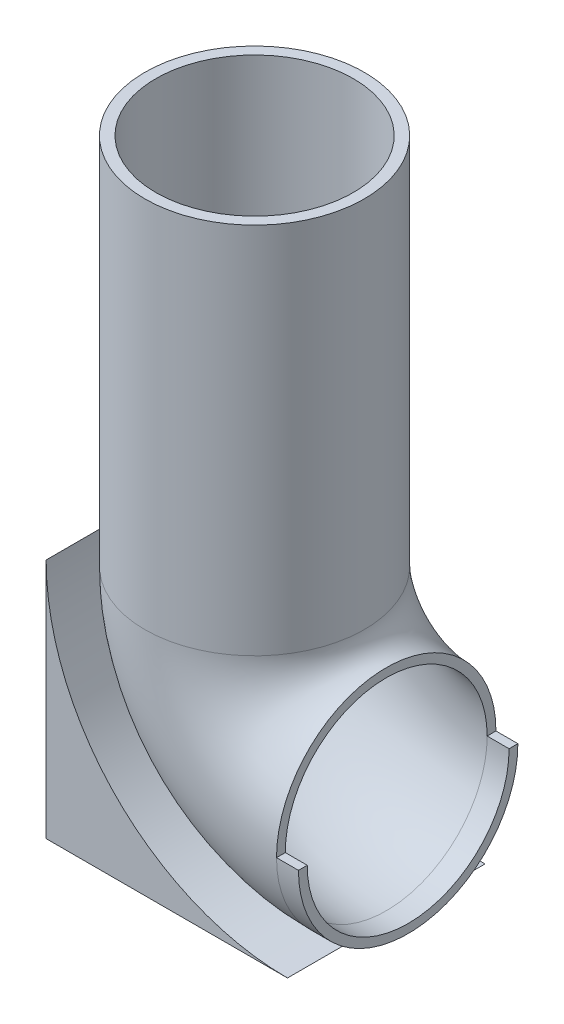
ISO-10303-21;
HEADER;
FILE_DESCRIPTION(('STEP AP214'),'2;1');
FILE_NAME('part.step','',(''),(''),'','','');
FILE_SCHEMA(('AUTOMOTIVE_DESIGN { 1 0 10303 214 1 1 1 1 }'));
ENDSEC;
DATA;
#1=APPLICATION_CONTEXT('core data for automotive mechanical design processes');
#2=APPLICATION_PROTOCOL_DEFINITION('international standard','automotive_design',2000,#1);
#3=PRODUCT_CONTEXT('',#1,'mechanical');
#4=PRODUCT('Part','Part','',(#3));
#5=PRODUCT_RELATED_PRODUCT_CATEGORY('part','',(#4));
#6=PRODUCT_DEFINITION_FORMATION('','',#4);
#7=PRODUCT_DEFINITION_CONTEXT('part definition',#1,'design');
#8=PRODUCT_DEFINITION('design','',#6,#7);
#9=PRODUCT_DEFINITION_SHAPE('','',#8);
#10=(LENGTH_UNIT() NAMED_UNIT(*) SI_UNIT(.MILLI.,.METRE.));
#11=(NAMED_UNIT(*) PLANE_ANGLE_UNIT() SI_UNIT($,.RADIAN.));
#12=(NAMED_UNIT(*) SI_UNIT($,.STERADIAN.) SOLID_ANGLE_UNIT());
#13=UNCERTAINTY_MEASURE_WITH_UNIT(LENGTH_MEASURE(1.E-05),#10,'distance_accuracy_value','');
#14=(GEOMETRIC_REPRESENTATION_CONTEXT(3) GLOBAL_UNCERTAINTY_ASSIGNED_CONTEXT((#13)) GLOBAL_UNIT_ASSIGNED_CONTEXT((#10,
#11,#12)) REPRESENTATION_CONTEXT('',''));
#15=CARTESIAN_POINT('',(0.,0.,0.));
#16=DIRECTION('',(0.,0.,1.));
#17=DIRECTION('',(1.,0.,0.));
#18=AXIS2_PLACEMENT_3D('',#15,#16,#17);
#19=CARTESIAN_POINT('',(0.,0.,22.5));
#20=DIRECTION('',(0.,0.,-1.));
#21=DIRECTION('',(-1.,0.,0.));
#22=AXIS2_PLACEMENT_3D('',#19,#20,#21);
#23=PLANE('',#22);
#24=CARTESIAN_POINT('',(30.0000000000001,0.,22.5));
#25=DIRECTION('',(0.,0.,-1.));
#26=DIRECTION('',(-1.,0.,0.));
#27=AXIS2_PLACEMENT_3D('',#24,#25,#26);
#28=CIRCLE('',#27,55.0000000000001);
#29=CARTESIAN_POINT('',(30.0000000000002,-55.,22.5));
#30=VERTEX_POINT('',#29);
#31=CARTESIAN_POINT('',(-25.,0.,22.5));
#32=VERTEX_POINT('',#31);
#33=EDGE_CURVE('E110',#30,#32,#28,.T.);
#34=ORIENTED_EDGE('',*,*,#33,.T.);
#35=DIRECTION('',(0.,-1.,0.));
#36=VECTOR('',#35,1.);
#37=CARTESIAN_POINT('',(-25.,0.,22.5));
#38=LINE('',#37,#36);
#39=CARTESIAN_POINT('',(-25.,-55.,22.5));
#40=VERTEX_POINT('',#39);
#41=EDGE_CURVE('E115',#32,#40,#38,.T.);
#42=ORIENTED_EDGE('',*,*,#41,.T.);
#43=DIRECTION('',(-1.,0.,0.));
#44=VECTOR('',#43,1.);
#45=CARTESIAN_POINT('',(30.0000000000002,-55.,22.5));
#46=LINE('',#45,#44);
#47=EDGE_CURVE('E90',#30,#40,#46,.T.);
#48=ORIENTED_EDGE('',*,*,#47,.F.);
#49=EDGE_LOOP('',(#34,#42,#48));
#50=FACE_BOUND('',#49,.T.);
#51=ADVANCED_FACE('F81',(#50),#23,.F.);
#52=CARTESIAN_POINT('',(0.,0.,-22.5));
#53=DIRECTION('',(0.,0.,-1.));
#54=DIRECTION('',(-1.,0.,0.));
#55=AXIS2_PLACEMENT_3D('',#52,#53,#54);
#56=PLANE('',#55);
#57=CARTESIAN_POINT('',(30.0000000000001,0.,-22.5));
#58=DIRECTION('',(0.,0.,-1.));
#59=DIRECTION('',(-1.,0.,0.));
#60=AXIS2_PLACEMENT_3D('',#57,#58,#59);
#61=CIRCLE('',#60,55.0000000000001);
#62=CARTESIAN_POINT('',(30.0000000000002,-55.,-22.5));
#63=VERTEX_POINT('',#62);
#64=CARTESIAN_POINT('',(-25.,0.,-22.5));
#65=VERTEX_POINT('',#64);
#66=EDGE_CURVE('E125',#63,#65,#61,.T.);
#67=ORIENTED_EDGE('',*,*,#66,.F.);
#68=DIRECTION('',(-1.,0.,0.));
#69=VECTOR('',#68,1.);
#70=CARTESIAN_POINT('',(30.0000000000002,-55.,-22.5));
#71=LINE('',#70,#69);
#72=CARTESIAN_POINT('',(-25.,-55.,-22.5));
#73=VERTEX_POINT('',#72);
#74=EDGE_CURVE('E13',#63,#73,#71,.T.);
#75=ORIENTED_EDGE('',*,*,#74,.T.);
#76=DIRECTION('',(0.,-1.,0.));
#77=VECTOR('',#76,1.);
#78=CARTESIAN_POINT('',(-25.,0.,-22.5));
#79=LINE('',#78,#77);
#80=EDGE_CURVE('E141',#65,#73,#79,.T.);
#81=ORIENTED_EDGE('',*,*,#80,.F.);
#82=EDGE_LOOP('',(#67,#75,#81));
#83=FACE_BOUND('',#82,.T.);
#84=ADVANCED_FACE('F157',(#83),#56,.T.);
#85=CARTESIAN_POINT('',(30.0000000000001,0.,-22.5));
#86=DIRECTION('',(0.,0.,1.));
#87=DIRECTION('',(1.,0.,0.));
#88=AXIS2_PLACEMENT_3D('',#85,#86,#87);
#89=CYLINDRICAL_SURFACE('',#88,55.0000000000001);
#90=ORIENTED_EDGE('',*,*,#33,.F.);
#91=DIRECTION('',(0.,0.,1.));
#92=VECTOR('',#91,1.);
#93=CARTESIAN_POINT('',(30.0000000000002,-55.,-22.5));
#94=LINE('',#93,#92);
#95=EDGE_CURVE('E121',#63,#30,#94,.T.);
#96=ORIENTED_EDGE('',*,*,#95,.F.);
#97=ORIENTED_EDGE('',*,*,#66,.T.);
#98=DIRECTION('',(0.,0.,1.));
#99=VECTOR('',#98,1.);
#100=CARTESIAN_POINT('',(-25.,0.,-22.5));
#101=LINE('',#100,#99);
#102=EDGE_CURVE('E129',#65,#32,#101,.T.);
#103=ORIENTED_EDGE('',*,*,#102,.T.);
#104=EDGE_LOOP('',(#90,#96,#97,#103));
#105=FACE_BOUND('',#104,.T.);
#106=ADVANCED_FACE('F127',(#105),#89,.F.);
#107=CARTESIAN_POINT('',(-25.,0.,-22.5));
#108=DIRECTION('',(-1.,0.,0.));
#109=DIRECTION('',(0.,0.,1.));
#110=AXIS2_PLACEMENT_3D('',#107,#108,#109);
#111=PLANE('',#110);
#112=ORIENTED_EDGE('',*,*,#41,.F.);
#113=ORIENTED_EDGE('',*,*,#102,.F.);
#114=ORIENTED_EDGE('',*,*,#80,.T.);
#115=DIRECTION('',(0.,0.,1.));
#116=VECTOR('',#115,1.);
#117=CARTESIAN_POINT('',(-25.,-55.,-22.5));
#118=LINE('',#117,#116);
#119=EDGE_CURVE('E118',#73,#40,#118,.T.);
#120=ORIENTED_EDGE('',*,*,#119,.T.);
#121=EDGE_LOOP('',(#112,#113,#114,#120));
#122=FACE_BOUND('',#121,.T.);
#123=ADVANCED_FACE('F156',(#122),#111,.T.);
#124=CARTESIAN_POINT('',(30.0000000000002,-55.,-22.5));
#125=DIRECTION('',(0.,1.,0.));
#126=DIRECTION('',(0.,0.,1.));
#127=AXIS2_PLACEMENT_3D('',#124,#125,#126);
#128=PLANE('',#127);
#129=CARTESIAN_POINT('',(-10.,-55.,15.));
#130=DIRECTION('',(0.,-1.,0.));
#131=DIRECTION('',(0.,0.,-1.));
#132=AXIS2_PLACEMENT_3D('',#129,#130,#131);
#133=CIRCLE('',#132,4.);
#134=CARTESIAN_POINT('',(-10.,-55.,11.));
#135=VERTEX_POINT('',#134);
#136=EDGE_CURVE('E133',#135,#135,#133,.T.);
#137=ORIENTED_EDGE('',*,*,#136,.F.);
#138=EDGE_LOOP('',(#137));
#139=FACE_BOUND('',#138,.T.);
#140=CARTESIAN_POINT('',(-10.,-55.,-15.));
#141=DIRECTION('',(0.,-1.,0.));
#142=DIRECTION('',(0.,0.,-1.));
#143=AXIS2_PLACEMENT_3D('',#140,#141,#142);
#144=CIRCLE('',#143,4.);
#145=CARTESIAN_POINT('',(-10.,-55.,-19.));
#146=VERTEX_POINT('',#145);
#147=EDGE_CURVE('E194',#146,#146,#144,.T.);
#148=ORIENTED_EDGE('',*,*,#147,.F.);
#149=EDGE_LOOP('',(#148));
#150=FACE_BOUND('',#149,.T.);
#151=ORIENTED_EDGE('',*,*,#47,.T.);
#152=ORIENTED_EDGE('',*,*,#119,.F.);
#153=ORIENTED_EDGE('',*,*,#74,.F.);
#154=ORIENTED_EDGE('',*,*,#95,.T.);
#155=EDGE_LOOP('',(#151,#152,#153,#154));
#156=FACE_BOUND('',#155,.T.);
#157=ADVANCED_FACE('F122',(#139,#150,#156),#128,.F.);
#158=CARTESIAN_POINT('',(-10.,-49.,-15.));
#159=DIRECTION('',(0.,-1.,0.));
#160=DIRECTION('',(0.,0.,-1.));
#161=AXIS2_PLACEMENT_3D('',#158,#159,#160);
#162=CYLINDRICAL_SURFACE('',#161,4.);
#163=CARTESIAN_POINT('',(-10.,-49.,-15.));
#164=DIRECTION('',(0.,-1.,0.));
#165=DIRECTION('',(0.,0.,-1.));
#166=AXIS2_PLACEMENT_3D('',#163,#164,#165);
#167=CIRCLE('',#166,4.);
#168=CARTESIAN_POINT('',(-10.,-49.,-19.));
#169=VERTEX_POINT('',#168);
#170=EDGE_CURVE('E197',#169,#169,#167,.T.);
#171=ORIENTED_EDGE('',*,*,#170,.F.);
#172=EDGE_LOOP('',(#171));
#173=FACE_BOUND('',#172,.T.);
#174=ORIENTED_EDGE('',*,*,#147,.T.);
#175=EDGE_LOOP('',(#174));
#176=FACE_BOUND('',#175,.T.);
#177=ADVANCED_FACE('F164',(#173,#176),#162,.F.);
#178=CARTESIAN_POINT('',(-10.,-49.,-15.));
#179=DIRECTION('',(0.,-1.,0.));
#180=DIRECTION('',(0.,0.,-1.));
#181=AXIS2_PLACEMENT_3D('',#178,#179,#180);
#182=PLANE('',#181);
#183=ORIENTED_EDGE('',*,*,#170,.T.);
#184=EDGE_LOOP('',(#183));
#185=FACE_BOUND('',#184,.T.);
#186=ADVANCED_FACE('F172',(#185),#182,.T.);
#187=CARTESIAN_POINT('',(-10.,-49.,15.));
#188=DIRECTION('',(0.,-1.,0.));
#189=DIRECTION('',(0.,0.,-1.));
#190=AXIS2_PLACEMENT_3D('',#187,#188,#189);
#191=CYLINDRICAL_SURFACE('',#190,4.);
#192=CARTESIAN_POINT('',(-10.,-49.,15.));
#193=DIRECTION('',(0.,-1.,0.));
#194=DIRECTION('',(0.,0.,-1.));
#195=AXIS2_PLACEMENT_3D('',#192,#193,#194);
#196=CIRCLE('',#195,4.);
#197=CARTESIAN_POINT('',(-10.,-49.,11.));
#198=VERTEX_POINT('',#197);
#199=EDGE_CURVE('E130',#198,#198,#196,.T.);
#200=ORIENTED_EDGE('',*,*,#199,.F.);
#201=EDGE_LOOP('',(#200));
#202=FACE_BOUND('',#201,.T.);
#203=ORIENTED_EDGE('',*,*,#136,.T.);
#204=EDGE_LOOP('',(#203));
#205=FACE_BOUND('',#204,.T.);
#206=ADVANCED_FACE('F180',(#202,#205),#191,.F.);
#207=CARTESIAN_POINT('',(-10.,-49.,15.));
#208=DIRECTION('',(0.,-1.,0.));
#209=DIRECTION('',(0.,0.,-1.));
#210=AXIS2_PLACEMENT_3D('',#207,#208,#209);
#211=PLANE('',#210);
#212=ORIENTED_EDGE('',*,*,#199,.T.);
#213=EDGE_LOOP('',(#212));
#214=FACE_BOUND('',#213,.T.);
#215=ADVANCED_FACE('F185',(#214),#211,.T.);
#216=CLOSED_SHELL('',(#51,#84,#106,#123,#157,#177,#186,#206,#215));
#217=MANIFOLD_SOLID_BREP('B2',#216);
#218=CARTESIAN_POINT('',(0.,85.,0.));
#219=DIRECTION('',(0.,1.,0.));
#220=DIRECTION('',(0.,0.,1.));
#221=AXIS2_PLACEMENT_3D('',#218,#219,#220);
#222=PLANE('',#221);
#223=CARTESIAN_POINT('',(0.,85.,0.));
#224=DIRECTION('',(0.,1.,0.));
#225=DIRECTION('',(0.,0.,1.));
#226=AXIS2_PLACEMENT_3D('',#223,#224,#225);
#227=CIRCLE('',#226,25.);
#228=CARTESIAN_POINT('',(0.,85.,25.));
#229=VERTEX_POINT('',#228);
#230=EDGE_CURVE('E343',#229,#229,#227,.T.);
#231=ORIENTED_EDGE('',*,*,#230,.T.);
#232=EDGE_LOOP('',(#231));
#233=FACE_BOUND('',#232,.T.);
#234=CARTESIAN_POINT('',(0.,85.,0.));
#235=DIRECTION('',(0.,1.,0.));
#236=DIRECTION('',(0.,0.,1.));
#237=AXIS2_PLACEMENT_3D('',#234,#235,#236);
#238=CIRCLE('',#237,22.5);
#239=CARTESIAN_POINT('',(0.,85.,22.5));
#240=VERTEX_POINT('',#239);
#241=EDGE_CURVE('E339',#240,#240,#238,.T.);
#242=ORIENTED_EDGE('',*,*,#241,.F.);
#243=EDGE_LOOP('',(#242));
#244=FACE_BOUND('',#243,.T.);
#245=ADVANCED_FACE('F256',(#233,#244),#222,.T.);
#246=CARTESIAN_POINT('',(0.,85.,0.));
#247=DIRECTION('',(0.,-1.,0.));
#248=DIRECTION('',(0.,0.,-1.));
#249=AXIS2_PLACEMENT_3D('',#246,#247,#248);
#250=CYLINDRICAL_SURFACE('',#249,25.);
#251=ORIENTED_EDGE('',*,*,#230,.F.);
#252=EDGE_LOOP('',(#251));
#253=FACE_BOUND('',#252,.T.);
#254=CARTESIAN_POINT('',(0.,0.,0.));
#255=DIRECTION('',(0.,1.,0.));
#256=DIRECTION('',(0.,0.,1.));
#257=AXIS2_PLACEMENT_3D('',#254,#255,#256);
#258=CIRCLE('',#257,25.);
#259=CARTESIAN_POINT('',(0.,0.,25.));
#260=VERTEX_POINT('',#259);
#261=EDGE_CURVE('E330',#260,#260,#258,.T.);
#262=ORIENTED_EDGE('',*,*,#261,.T.);
#263=EDGE_LOOP('',(#262));
#264=FACE_BOUND('',#263,.T.);
#265=ADVANCED_FACE('F258',(#253,#264),#250,.T.);
#266=CARTESIAN_POINT('',(0.,85.,0.));
#267=DIRECTION('',(0.,-1.,0.));
#268=DIRECTION('',(0.,0.,-1.));
#269=AXIS2_PLACEMENT_3D('',#266,#267,#268);
#270=CYLINDRICAL_SURFACE('',#269,22.5);
#271=ORIENTED_EDGE('',*,*,#241,.T.);
#272=EDGE_LOOP('',(#271));
#273=FACE_BOUND('',#272,.T.);
#274=CARTESIAN_POINT('',(0.,-2.,0.));
#275=DIRECTION('',(0.,1.,0.));
#276=DIRECTION('',(0.,0.,1.));
#277=AXIS2_PLACEMENT_3D('',#274,#275,#276);
#278=CIRCLE('',#277,22.5);
#279=CARTESIAN_POINT('',(0.,-2.,22.5));
#280=VERTEX_POINT('',#279);
#281=EDGE_CURVE('E360',#280,#280,#278,.T.);
#282=ORIENTED_EDGE('',*,*,#281,.F.);
#283=EDGE_LOOP('',(#282));
#284=FACE_BOUND('',#283,.T.);
#285=ADVANCED_FACE('F393',(#273,#284),#270,.F.);
#286=CARTESIAN_POINT('',(30.,0.,0.));
#287=DIRECTION('',(0.,0.,-1.));
#288=DIRECTION('',(-1.,0.,0.));
#289=AXIS2_PLACEMENT_3D('',#286,#287,#288);
#290=TOROIDAL_SURFACE('',#289,30.,25.);
#291=CARTESIAN_POINT('',(30.0000000000001,-30.,0.));
#292=DIRECTION('',(1.,0.,0.));
#293=DIRECTION('',(0.,1.,0.));
#294=AXIS2_PLACEMENT_3D('',#291,#292,#293);
#295=CIRCLE('',#294,25.);
#296=CARTESIAN_POINT('',(30.0000000000001,-30.,25.));
#297=VERTEX_POINT('',#296);
#298=CARTESIAN_POINT('',(30.0000000000001,-30.,-25.));
#299=VERTEX_POINT('',#298);
#300=EDGE_CURVE('E318',#297,#299,#295,.T.);
#301=ORIENTED_EDGE('',*,*,#300,.F.);
#302=CARTESIAN_POINT('',(30.0000000000001,-30.,0.));
#303=DIRECTION('',(-1.,0.,0.));
#304=DIRECTION('',(0.,-1.,0.));
#305=AXIS2_PLACEMENT_3D('',#302,#303,#304);
#306=CIRCLE('',#305,25.);
#307=EDGE_CURVE('E294',#297,#299,#306,.T.);
#308=ORIENTED_EDGE('',*,*,#307,.T.);
#309=EDGE_LOOP('',(#301,#308));
#310=FACE_BOUND('',#309,.T.);
#311=ORIENTED_EDGE('',*,*,#261,.F.);
#312=EDGE_LOOP('',(#311));
#313=FACE_BOUND('',#312,.T.);
#314=ADVANCED_FACE('F323',(#310,#313),#290,.T.);
#315=CARTESIAN_POINT('',(35.0000000000001,-30.,0.));
#316=DIRECTION('',(-1.,0.,0.));
#317=DIRECTION('',(0.,-1.,0.));
#318=AXIS2_PLACEMENT_3D('',#315,#316,#317);
#319=CYLINDRICAL_SURFACE('',#318,25.);
#320=CARTESIAN_POINT('',(35.0000000000001,-30.,0.));
#321=DIRECTION('',(1.,0.,0.));
#322=DIRECTION('',(0.,1.,0.));
#323=AXIS2_PLACEMENT_3D('',#320,#321,#322);
#324=CIRCLE('',#323,25.);
#325=CARTESIAN_POINT('',(35.0000000000001,-30.,25.));
#326=VERTEX_POINT('',#325);
#327=CARTESIAN_POINT('',(35.0000000000001,-30.,-25.));
#328=VERTEX_POINT('',#327);
#329=EDGE_CURVE('E320',#326,#328,#324,.T.);
#330=ORIENTED_EDGE('',*,*,#329,.F.);
#331=DIRECTION('',(1.,0.,0.));
#332=VECTOR('',#331,1.);
#333=CARTESIAN_POINT('',(30.0000000000001,-30.,25.));
#334=LINE('',#333,#332);
#335=EDGE_CURVE('E308',#297,#326,#334,.T.);
#336=ORIENTED_EDGE('',*,*,#335,.F.);
#337=ORIENTED_EDGE('',*,*,#300,.T.);
#338=DIRECTION('',(1.,0.,0.));
#339=VECTOR('',#338,1.);
#340=CARTESIAN_POINT('',(30.0000000000001,-30.,-25.));
#341=LINE('',#340,#339);
#342=EDGE_CURVE('E303',#299,#328,#341,.T.);
#343=ORIENTED_EDGE('',*,*,#342,.T.);
#344=EDGE_LOOP('',(#330,#336,#337,#343));
#345=FACE_BOUND('',#344,.T.);
#346=ADVANCED_FACE('F316',(#345),#319,.T.);
#347=CARTESIAN_POINT('',(35.0000000000001,-30.,0.));
#348=DIRECTION('',(1.,0.,0.));
#349=DIRECTION('',(0.,1.,0.));
#350=AXIS2_PLACEMENT_3D('',#347,#348,#349);
#351=PLANE('',#350);
#352=DIRECTION('',(0.,0.,-1.));
#353=VECTOR('',#352,1.);
#354=CARTESIAN_POINT('',(35.0000000000001,-30.,25.));
#355=LINE('',#354,#353);
#356=CARTESIAN_POINT('',(35.0000000000001,-30.,23.));
#357=VERTEX_POINT('',#356);
#358=EDGE_CURVE('E359',#326,#357,#355,.T.);
#359=ORIENTED_EDGE('',*,*,#358,.F.);
#360=ORIENTED_EDGE('',*,*,#329,.T.);
#361=CARTESIAN_POINT('',(35.0000000000001,-30.,-23.));
#362=VERTEX_POINT('',#361);
#363=EDGE_CURVE('E351',#362,#328,#355,.T.);
#364=ORIENTED_EDGE('',*,*,#363,.F.);
#365=CARTESIAN_POINT('',(35.0000000000001,-30.,0.));
#366=DIRECTION('',(1.,0.,0.));
#367=DIRECTION('',(0.,1.,0.));
#368=AXIS2_PLACEMENT_3D('',#365,#366,#367);
#369=CIRCLE('',#368,23.);
#370=EDGE_CURVE('E333',#357,#362,#369,.T.);
#371=ORIENTED_EDGE('',*,*,#370,.F.);
#372=EDGE_LOOP('',(#359,#360,#364,#371));
#373=FACE_BOUND('',#372,.T.);
#374=ADVANCED_FACE('F357',(#373),#351,.T.);
#375=CARTESIAN_POINT('',(30.,0.,0.));
#376=DIRECTION('',(0.,0.,-1.));
#377=DIRECTION('',(-1.,0.,0.));
#378=AXIS2_PLACEMENT_3D('',#375,#376,#377);
#379=TOROIDAL_SURFACE('',#378,30.,23.);
#380=CARTESIAN_POINT('',(30.0000000000001,-30.,0.));
#381=DIRECTION('',(-1.,0.,0.));
#382=DIRECTION('',(0.,-1.,0.));
#383=AXIS2_PLACEMENT_3D('',#380,#381,#382);
#384=CIRCLE('',#383,23.);
#385=CARTESIAN_POINT('',(30.0000000000001,-30.,-23.));
#386=VERTEX_POINT('',#385);
#387=CARTESIAN_POINT('',(30.0000000000001,-30.,23.));
#388=VERTEX_POINT('',#387);
#389=EDGE_CURVE('E276',#386,#388,#384,.F.);
#390=ORIENTED_EDGE('',*,*,#389,.T.);
#391=EDGE_CURVE('E302',#388,#386,#384,.F.);
#392=ORIENTED_EDGE('',*,*,#391,.T.);
#393=EDGE_LOOP('',(#390,#392));
#394=FACE_BOUND('',#393,.T.);
#395=CARTESIAN_POINT('',(-16.1521800609827,-2.,-16.3311344858411));
#396=CARTESIAN_POINT('',(-15.6926575254816,-2.,-16.7864193980092));
#397=CARTESIAN_POINT('',(-15.213968669036,-2.,-17.2222546662401));
#398=CARTESIAN_POINT('',(-14.2214193138179,-2.,-18.0521918617121));
#399=CARTESIAN_POINT('',(-13.7075494564307,-2.,-18.4462826127835));
#400=CARTESIAN_POINT('',(-12.6478514648188,-2.,-19.1901855512612));
#401=CARTESIAN_POINT('',(-12.1019881106165,-2.,-19.5399475477929));
#402=CARTESIAN_POINT('',(-10.9827539200928,-2.,-20.1921863736468));
#403=CARTESIAN_POINT('',(-10.4093849401818,-2.,-20.4946663882742));
#404=CARTESIAN_POINT('',(-9.23949888869036,-2.,-21.0500886829596));
#405=CARTESIAN_POINT('',(-8.64299388201044,-2.,-21.3030563772269));
#406=CARTESIAN_POINT('',(-7.43079481547017,-2.,-21.7578764219807));
#407=CARTESIAN_POINT('',(-6.81510045381304,-2.,-21.959727968092));
#408=CARTESIAN_POINT('',(-5.56907365480272,-2.,-22.310856956331));
#409=CARTESIAN_POINT('',(-4.93874509498806,-2.,-22.4601481593653));
#410=CARTESIAN_POINT('',(-3.6677703630087,-2.,-22.7052020603749));
#411=CARTESIAN_POINT('',(-3.02712422184022,-2.,-22.80096491913));
#412=CARTESIAN_POINT('',(-1.73923523342294,-2.,-22.9384078396291));
#413=CARTESIAN_POINT('',(-1.09198505176568,-2.,-22.9800191722588));
#414=CARTESIAN_POINT('',(0.203721546881954,-2.,-23.0086816011404));
#415=CARTESIAN_POINT('',(0.852177965436526,-2.,-22.9957326265915));
#416=CARTESIAN_POINT('',(2.14574403765465,-2.,-22.9154127847956));
#417=CARTESIAN_POINT('',(2.79085351614781,-2.,-22.8480390974455));
#418=CARTESIAN_POINT('',(4.07314309619693,-2.,-22.6593984639075));
#419=CARTESIAN_POINT('',(4.71032318272901,-2.,-22.5381314156235));
#420=CARTESIAN_POINT('',(5.9740743629958,-2.,-22.2422012808867));
#421=CARTESIAN_POINT('',(6.6006100921216,-2.,-22.0673871728954));
#422=CARTESIAN_POINT('',(7.83679631730266,-2.,-21.6657898134567));
#423=CARTESIAN_POINT('',(8.44644679249724,-2.,-21.4390064978077));
#424=CARTESIAN_POINT('',(9.64458488843265,-2.,-20.9351534558422));
#425=CARTESIAN_POINT('',(10.2330729166768,-2.,-20.6580846984422));
#426=CARTESIAN_POINT('',(11.3848067532069,-2.,-20.0556891263433));
#427=CARTESIAN_POINT('',(11.9480524710712,-2.,-19.7303621387943));
#428=CARTESIAN_POINT('',(13.0481935102415,-2.,-19.0320471424553));
#429=CARTESIAN_POINT('',(13.5849408057043,-2.,-18.6588259223683));
#430=CARTESIAN_POINT('',(14.6252851588449,-2.,-17.8687383319873));
#431=CARTESIAN_POINT('',(15.1288821020005,-2.,-17.4518718109278));
#432=CARTESIAN_POINT('',(16.0995165014533,-2.,-16.577434194432));
#433=CARTESIAN_POINT('',(16.5665495667199,-2.,-16.1198582241686));
#434=CARTESIAN_POINT('',(17.4607594053644,-2.,-15.1673202270641));
#435=CARTESIAN_POINT('',(17.8879359468592,-2.,-14.6723579827418));
#436=CARTESIAN_POINT('',(18.7023863145778,-2.,-13.6448096288823));
#437=CARTESIAN_POINT('',(19.0893573882524,-2.,-13.1119827340714));
#438=CARTESIAN_POINT('',(19.6350393901427,-2.,-12.2899102491123));
#439=CARTESIAN_POINT('',(19.8111453749308,-2.,-12.012066601675));
#440=CARTESIAN_POINT('',(20.1515277307385,-2.,-11.4491204648222));
#441=CARTESIAN_POINT('',(20.3158008923244,-2.,-11.1640160342242));
#442=CARTESIAN_POINT('',(20.7902696333907,-2.,-10.2987141520804));
#443=CARTESIAN_POINT('',(21.0822125995843,-2.,-9.70838029140693));
#444=CARTESIAN_POINT('',(21.6147716228901,-2.,-8.50499702131085));
#445=CARTESIAN_POINT('',(21.855389172049,-2.,-7.89194827282576));
#446=CARTESIAN_POINT('',(22.175655118788,-2.,-6.95983997765273));
#447=CARTESIAN_POINT('',(22.2754950941204,-2.,-6.64760221958503));
#448=CARTESIAN_POINT('',(22.4615752123163,-2.,-6.01918966454013));
#449=CARTESIAN_POINT('',(22.547818830936,-2.,-5.70301589613211));
#450=CARTESIAN_POINT('',(22.7858033981648,-2.,-4.74925681688985));
#451=CARTESIAN_POINT('',(22.916822930735,-2.,-4.10636145040781));
#452=CARTESIAN_POINT('',(23.1216581394896,-2.,-2.8119308154001));
#453=CARTESIAN_POINT('',(23.1955031162419,-2.,-2.16040014661843));
#454=CARTESIAN_POINT('',(23.2849916995733,-2.,-0.85334090478862));
#455=CARTESIAN_POINT('',(23.3006378093596,-2.,-0.197812504902748));
#456=CARTESIAN_POINT('',(23.274021388634,-2.,1.08562440319145));
#457=CARTESIAN_POINT('',(23.2340655218374,-2.,1.71358208706634));
#458=CARTESIAN_POINT('',(23.1009202111351,-2.,2.96379224834695));
#459=CARTESIAN_POINT('',(23.0077316249073,-2.,3.58604481750854));
#460=CARTESIAN_POINT('',(22.7693144117282,-2.,4.82075351444813));
#461=CARTESIAN_POINT('',(22.6240700341903,-2.,5.43320661853546));
#462=CARTESIAN_POINT('',(22.3685302313426,-2.,6.34107544319904));
#463=CARTESIAN_POINT('',(22.277065058318,-2.,6.64191362944558));
#464=CARTESIAN_POINT('',(22.0817807642377,-2.,7.23963374172556));
#465=CARTESIAN_POINT('',(21.9779587431334,-2.,7.53651472078432));
#466=CARTESIAN_POINT('',(21.6480078898674,-2.,8.42129893184051));
#467=CARTESIAN_POINT('',(21.4036322582824,-2.,9.0024997017709));
#468=CARTESIAN_POINT('',(20.8684120551748,-2.,10.1430955757506));
#469=CARTESIAN_POINT('',(20.5775664262623,-2.,10.7024901832566));
#470=CARTESIAN_POINT('',(20.1081575323736,-2.,11.5225008886526));
#471=CARTESIAN_POINT('',(19.9461359663171,-2.,11.7926992207045));
#472=CARTESIAN_POINT('',(19.6113581918716,-2.,12.3262670918269));
#473=CARTESIAN_POINT('',(19.438604657412,-2.,12.5896383089174));
#474=CARTESIAN_POINT('',(18.90457898242,-2.,13.3690313712884));
#475=CARTESIAN_POINT('',(18.5275243416873,-2.,13.8743630573373));
#476=CARTESIAN_POINT('',(17.7182637156236,-2.,14.8723732273397));
#477=CARTESIAN_POINT('',(17.2844645497111,-2.,15.3637572254849));
#478=CARTESIAN_POINT('',(16.3772222154077,-2.,16.308499853078));
#479=CARTESIAN_POINT('',(15.9037780475323,-2.,16.7618575232725));
#480=CARTESIAN_POINT('',(14.9205181931885,-2.,17.6272929111927));
#481=CARTESIAN_POINT('',(14.410700864263,-2.,18.0393687627847));
#482=CARTESIAN_POINT('',(13.3582493665743,-2.,18.8192331657889));
#483=CARTESIAN_POINT('',(12.8156153525256,-2.,19.1870219259683));
#484=CARTESIAN_POINT('',(11.6987946249169,-2.,19.8771759093526));
#485=CARTESIAN_POINT('',(11.1244765231026,-2.,20.1993285669752));
#486=CARTESIAN_POINT('',(9.95060924206719,-2.,20.7938276774854));
#487=CARTESIAN_POINT('',(9.35105990885838,-2.,21.0661738263468));
#488=CARTESIAN_POINT('',(8.13101425408906,-2.,21.5590071777136));
#489=CARTESIAN_POINT('',(7.51051804810055,-2.,21.7794946662897));
#490=CARTESIAN_POINT('',(6.25303253341804,-2.,22.1669364885114));
#491=CARTESIAN_POINT('',(5.61604333503424,-2.,22.3338911801007));
#492=CARTESIAN_POINT('',(4.33460010227464,-2.,22.6120235341551));
#493=CARTESIAN_POINT('',(3.69022774050706,-2.,22.7235775768776));
#494=CARTESIAN_POINT('',(2.39435413164893,-2.,22.8917608139302));
#495=CARTESIAN_POINT('',(1.74285291167736,-2.,22.9483902171262));
#496=CARTESIAN_POINT('',(0.4374122221025,-2.,23.0062608346488));
#497=CARTESIAN_POINT('',(-0.216527179834112,-2.,23.0075035748415));
#498=CARTESIAN_POINT('',(-1.52215773494206,-2.,22.9545470669805));
#499=CARTESIAN_POINT('',(-2.17384889436919,-2.,22.9003479733204));
#500=CARTESIAN_POINT('',(-3.46692359629845,-2.,22.7372812533409));
#501=CARTESIAN_POINT('',(-4.10834304497831,-2.,22.6286982512655));
#502=CARTESIAN_POINT('',(-5.37971986504905,-2.,22.3577503644255));
#503=CARTESIAN_POINT('',(-6.00967727697051,-2.,22.1953856698757));
#504=CARTESIAN_POINT('',(-7.25361210238697,-2.,21.8180080771643));
#505=CARTESIAN_POINT('',(-7.86758971152939,-2.,21.6029958239247));
#506=CARTESIAN_POINT('',(-9.07517065444511,-2.,21.1218360648219));
#507=CARTESIAN_POINT('',(-9.66877401256356,-2.,20.8556886200627));
#508=CARTESIAN_POINT('',(-10.829654366344,-2.,20.2749907292944));
#509=CARTESIAN_POINT('',(-11.3970028744203,-2.,19.9605832355885));
#510=CARTESIAN_POINT('',(-12.50315510718,-2.,19.2850295821032));
#511=CARTESIAN_POINT('',(-13.0419588910842,-2.,18.9238835192962));
#512=CARTESIAN_POINT('',(-14.0871680276657,-2.,18.1574163861177));
#513=CARTESIAN_POINT('',(-14.5935735623875,-2.,17.7520955639971));
#514=CARTESIAN_POINT('',(-15.5703677404151,-2.,16.9001580905109));
#515=CARTESIAN_POINT('',(-16.040756405545,-2.,16.4535414641685));
#516=CARTESIAN_POINT('',(-16.9414398208475,-2.,15.5229267266313));
#517=CARTESIAN_POINT('',(-17.3717966113448,-2.,15.0389886587023));
#518=CARTESIAN_POINT('',(-18.1901804079075,-2.,14.0365548552536));
#519=CARTESIAN_POINT('',(-18.5782074620006,-2.,13.5180591589441));
#520=CARTESIAN_POINT('',(-19.3091615164887,-2.,12.4501978292283));
#521=CARTESIAN_POINT('',(-19.6520885918447,-2.,11.9008322471333));
#522=CARTESIAN_POINT('',(-20.2903948142374,-2.,10.7751396299389));
#523=CARTESIAN_POINT('',(-20.5857739770919,-2.,10.1988126038089));
#524=CARTESIAN_POINT('',(-21.1266523269663,-2.,9.02378400590773));
#525=CARTESIAN_POINT('',(-21.3721923011671,-2.,8.42510120854565));
#526=CARTESIAN_POINT('',(-21.8119453210343,-2.,7.20917270180321));
#527=CARTESIAN_POINT('',(-22.0061583882924,-2.,6.59192700023179));
#528=CARTESIAN_POINT('',(-22.3418654386283,-2.,5.34328929414631));
#529=CARTESIAN_POINT('',(-22.4833616007508,-2.,4.71189787548709));
#530=CARTESIAN_POINT('',(-22.7126367849094,-2.,3.43943674473733));
#531=CARTESIAN_POINT('',(-22.800415868668,-2.,2.79836704376829));
#532=CARTESIAN_POINT('',(-22.9216002073231,-2.,1.51143757080273));
#533=CARTESIAN_POINT('',(-22.955033053605,-2.,0.865580396810736));
#534=CARTESIAN_POINT('',(-22.9673727585874,-2.,-0.426657004303744));
#535=CARTESIAN_POINT('',(-22.946279419517,-2.,-1.0730372333149));
#536=CARTESIAN_POINT('',(-22.8497041834717,-2.,-2.36188835981571));
#537=CARTESIAN_POINT('',(-22.7742083636222,-2.,-3.00435821409404));
#538=CARTESIAN_POINT('',(-22.56935276602,-2.,-4.28064150050898));
#539=CARTESIAN_POINT('',(-22.4399938450597,-2.,-4.91445507017423));
#540=CARTESIAN_POINT('',(-22.1282764603488,-2.,-6.16916037068424));
#541=CARTESIAN_POINT('',(-21.9458985591163,-2.,-6.79004727281584));
#542=CARTESIAN_POINT('',(-21.5294508477414,-2.,-8.01427988395138));
#543=CARTESIAN_POINT('',(-21.2953775817586,-2.,-8.61762441719326));
#544=CARTESIAN_POINT('',(-20.7774967690291,-2.,-9.80178604301557));
#545=CARTESIAN_POINT('',(-20.4937449810371,-2.,-10.382627509511));
#546=CARTESIAN_POINT('',(-19.8784623744136,-2.,-11.5181825073866));
#547=CARTESIAN_POINT('',(-19.546944243503,-2.,-12.0729029253016));
#548=CARTESIAN_POINT('',(-18.7526122293567,-2.,-13.2831671053083));
#549=CARTESIAN_POINT('',(-18.2774360456031,-2.,-13.9306450908125));
#550=CARTESIAN_POINT('',(-17.2620516555368,-2.,-15.1724237457622));
#551=CARTESIAN_POINT('',(-16.7218434504741,-2.,-15.76672441623));
#552=CARTESIAN_POINT('',(-16.1521800609827,-2.,-16.3311344858411));
#553=B_SPLINE_CURVE_WITH_KNOTS('',3,(#395,#396,#397,#398,#399,#400,#401,#402,#403,#404,#405,
#406,#407,#408,#409,#410,#411,#412,#413,#414,#415,#416,#417,#418,#419,#420,#421,#422,#423,#424,
#425,#426,#427,#428,#429,#430,#431,#432,#433,#434,#435,#436,#437,#438,#439,#440,#441,#442,#443,
#444,#445,#446,#447,#448,#449,#450,#451,#452,#453,#454,#455,#456,#457,#458,#459,#460,#461,#462,
#463,#464,#465,#466,#467,#468,#469,#470,#471,#472,#473,#474,#475,#476,#477,#478,#479,#480,#481,
#482,#483,#484,#485,#486,#487,#488,#489,#490,#491,#492,#493,#494,#495,#496,#497,#498,#499,#500,
#501,#502,#503,#504,#505,#506,#507,#508,#509,#510,#511,#512,#513,#514,#515,#516,#517,#518,#519,
#520,#521,#522,#523,#524,#525,#526,#527,#528,#529,#530,#531,#532,#533,#534,#535,#536,#537,#538,
#539,#540,#541,#542,#543,#544,#545,#546,#547,#548,#549,#550,#551,#552),.UNSPECIFIED.,.T.,.F.,(4,
2,2,2,2,2,2,2,2,2,2,2,2,2,2,2,2,2,2,2,2,2,2,2,2,2,2,2,2,2,2,2,2,2,2,2,2,2,2,2,2,2,2,2,2,2,2,2,2,
2,2,2,2,2,2,2,2,2,2,2,2,2,2,2,2,2,2,2,2,2,2,2,2,2,2,2,2,2,4),(0.,1.93991839425366,
3.88035485291781,5.82296909189847,7.76545240386777,9.70693602743569,11.6484502007265,
13.5894556844593,15.5304553380846,17.473916113453,19.4173794107803,21.3609434182151,
23.3045111075702,25.2536116155399,27.2027145313943,29.151779895276,31.1008522404421,
33.0598034131403,35.0187613529353,36.9779541882633,38.9371584213613,40.9101838602588,
41.8967929639434,42.8836686671805,44.8568895332225,46.8300530292678,47.8132187803079,
48.7961327870658,50.7617322537763,52.7263237306426,54.6908307069543,56.5762250577013,
58.4615890321014,60.34752394572,61.2906002624067,62.2338983492613,64.1231163498011,
66.0123773442021,66.9573097385098,67.9020076346711,69.7912985354554,71.7554404296768,
73.7196318565116,75.6839120340697,77.6481829517354,79.6213217811544,81.5944726545013,
83.5676126429897,85.5407394379203,87.5002713074419,89.4597957252785,91.4192661594776,
93.3787311369925,95.3280465488011,97.2773550663529,99.2266397064659,101.175922017302,
103.119537933836,105.063149817854,107.006750779832,108.950350564094,110.890886195384,
112.831419624908,114.771949829014,116.712479387556,118.651414403453,120.5903486037,
122.529202649526,124.468054467548,126.405921629823,128.343795820908,130.2821661358,
132.220505618498,134.159556621009,136.098737288534,138.03575522841,139.972259601852,
142.377148206164,144.782036764246),.UNSPECIFIED.);
#554=CARTESIAN_POINT('',(-16.1521800609827,-2.,-16.3311344858411));
#555=VERTEX_POINT('',#554);
#556=EDGE_CURVE('E326',#555,#555,#553,.T.);
#557=ORIENTED_EDGE('',*,*,#556,.F.);
#558=EDGE_LOOP('',(#557));
#559=FACE_BOUND('',#558,.T.);
#560=ADVANCED_FACE('F372',(#394,#559),#379,.F.);
#561=CARTESIAN_POINT('',(0.,-2.,0.));
#562=DIRECTION('',(0.,1.,0.));
#563=DIRECTION('',(0.,0.,1.));
#564=AXIS2_PLACEMENT_3D('',#561,#562,#563);
#565=PLANE('',#564);
#566=ORIENTED_EDGE('',*,*,#281,.T.);
#567=EDGE_LOOP('',(#566));
#568=FACE_BOUND('',#567,.T.);
#569=ORIENTED_EDGE('',*,*,#556,.T.);
#570=EDGE_LOOP('',(#569));
#571=FACE_BOUND('',#570,.T.);
#572=ADVANCED_FACE('F375',(#568,#571),#565,.F.);
#573=CARTESIAN_POINT('',(35.0000000000001,-30.,0.));
#574=DIRECTION('',(-1.,0.,0.));
#575=DIRECTION('',(0.,-1.,0.));
#576=AXIS2_PLACEMENT_3D('',#573,#574,#575);
#577=CYLINDRICAL_SURFACE('',#576,23.);
#578=DIRECTION('',(-1.,0.,0.));
#579=VECTOR('',#578,1.);
#580=CARTESIAN_POINT('',(35.0000000000001,-30.,23.));
#581=LINE('',#580,#579);
#582=EDGE_CURVE('E79',#357,#388,#581,.T.);
#583=ORIENTED_EDGE('',*,*,#582,.F.);
#584=ORIENTED_EDGE('',*,*,#370,.T.);
#585=DIRECTION('',(-1.,0.,0.));
#586=VECTOR('',#585,1.);
#587=CARTESIAN_POINT('',(35.0000000000001,-30.,-23.));
#588=LINE('',#587,#586);
#589=EDGE_CURVE('E265',#386,#362,#588,.F.);
#590=ORIENTED_EDGE('',*,*,#589,.F.);
#591=ORIENTED_EDGE('',*,*,#391,.F.);
#592=EDGE_LOOP('',(#583,#584,#590,#591));
#593=FACE_BOUND('',#592,.T.);
#594=ADVANCED_FACE('F362',(#593),#577,.F.);
#595=CARTESIAN_POINT('',(30.0000000000001,-30.,25.));
#596=DIRECTION('',(0.,-1.,0.));
#597=DIRECTION('',(1.,0.,0.));
#598=AXIS2_PLACEMENT_3D('',#595,#596,#597);
#599=PLANE('',#598);
#600=ORIENTED_EDGE('',*,*,#582,.T.);
#601=DIRECTION('',(0.,0.,-1.));
#602=VECTOR('',#601,1.);
#603=CARTESIAN_POINT('',(30.0000000000001,-30.,25.));
#604=LINE('',#603,#602);
#605=EDGE_CURVE('E272',#297,#388,#604,.T.);
#606=ORIENTED_EDGE('',*,*,#605,.F.);
#607=ORIENTED_EDGE('',*,*,#335,.T.);
#608=ORIENTED_EDGE('',*,*,#358,.T.);
#609=EDGE_LOOP('',(#600,#606,#607,#608));
#610=FACE_BOUND('',#609,.T.);
#611=ADVANCED_FACE('F307',(#610),#599,.F.);
#612=CARTESIAN_POINT('',(30.0000000000001,-24.6114857463779,0.));
#613=DIRECTION('',(-1.,0.,0.));
#614=DIRECTION('',(0.,-1.,0.));
#615=AXIS2_PLACEMENT_3D('',#612,#613,#614);
#616=PLANE('',#615);
#617=ORIENTED_EDGE('',*,*,#605,.T.);
#618=ORIENTED_EDGE('',*,*,#389,.F.);
#619=EDGE_CURVE('E296',#386,#299,#604,.T.);
#620=ORIENTED_EDGE('',*,*,#619,.T.);
#621=ORIENTED_EDGE('',*,*,#307,.F.);
#622=EDGE_LOOP('',(#617,#618,#620,#621));
#623=FACE_BOUND('',#622,.T.);
#624=ADVANCED_FACE('F295',(#623),#616,.F.);
#625=ORIENTED_EDGE('',*,*,#589,.T.);
#626=ORIENTED_EDGE('',*,*,#363,.T.);
#627=ORIENTED_EDGE('',*,*,#342,.F.);
#628=ORIENTED_EDGE('',*,*,#619,.F.);
#629=EDGE_LOOP('',(#625,#626,#627,#628));
#630=FACE_BOUND('',#629,.T.);
#631=ADVANCED_FACE('F350',(#630),#599,.F.);
#632=CLOSED_SHELL('',(#245,#265,#285,#314,#346,#374,#560,#572,#594,#611,#624,#631));
#633=MANIFOLD_SOLID_BREP('B7',#632);
#634=ADVANCED_BREP_SHAPE_REPRESENTATION('',(#18,#217,#633),#14);
#635=SHAPE_DEFINITION_REPRESENTATION(#9,#634);
ENDSEC;
END-ISO-10303-21;
